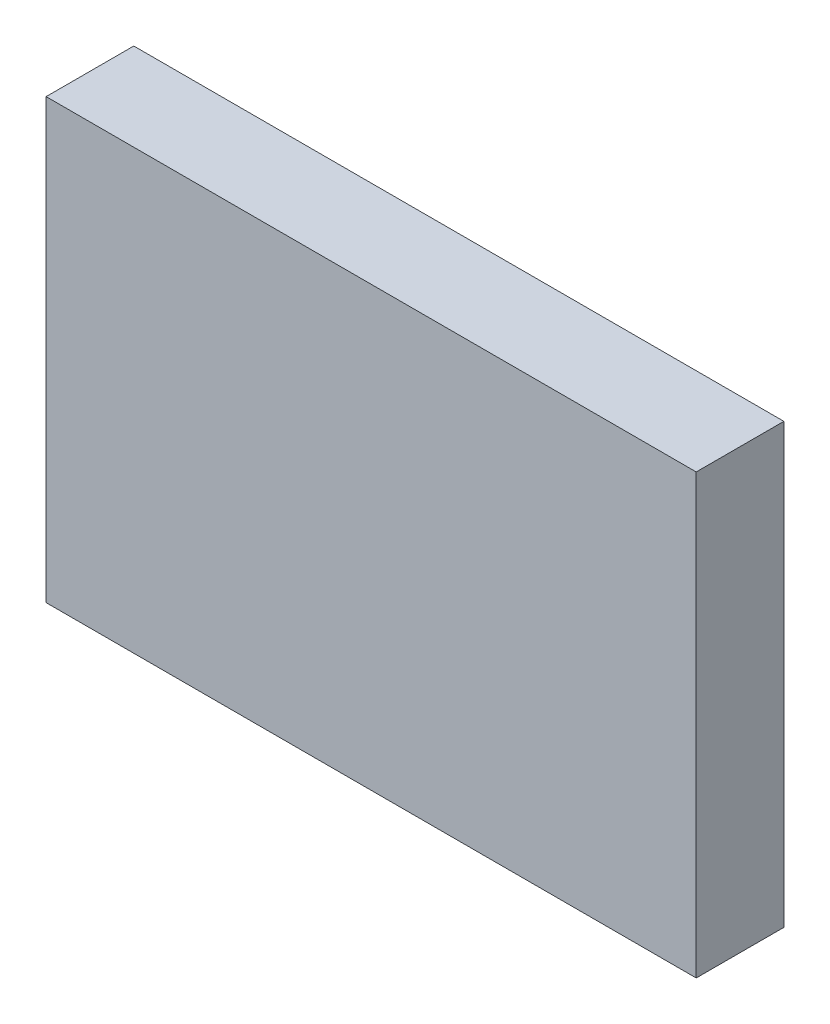
ISO-10303-21;
HEADER;
FILE_DESCRIPTION(('STEP AP214'),'2;1');
FILE_NAME('part.step','',(''),(''),'','','');
FILE_SCHEMA(('AUTOMOTIVE_DESIGN { 1 0 10303 214 1 1 1 1 }'));
ENDSEC;
DATA;
#1=APPLICATION_CONTEXT('core data for automotive mechanical design processes');
#2=APPLICATION_PROTOCOL_DEFINITION('international standard','automotive_design',2000,#1);
#3=PRODUCT_CONTEXT('',#1,'mechanical');
#4=PRODUCT('Part','Part','',(#3));
#5=PRODUCT_RELATED_PRODUCT_CATEGORY('part','',(#4));
#6=PRODUCT_DEFINITION_FORMATION('','',#4);
#7=PRODUCT_DEFINITION_CONTEXT('part definition',#1,'design');
#8=PRODUCT_DEFINITION('design','',#6,#7);
#9=PRODUCT_DEFINITION_SHAPE('','',#8);
#10=(LENGTH_UNIT() NAMED_UNIT(*) SI_UNIT(.MILLI.,.METRE.));
#11=(NAMED_UNIT(*) PLANE_ANGLE_UNIT() SI_UNIT($,.RADIAN.));
#12=(NAMED_UNIT(*) SI_UNIT($,.STERADIAN.) SOLID_ANGLE_UNIT());
#13=UNCERTAINTY_MEASURE_WITH_UNIT(LENGTH_MEASURE(1.E-05),#10,'distance_accuracy_value','');
#14=(GEOMETRIC_REPRESENTATION_CONTEXT(3) GLOBAL_UNCERTAINTY_ASSIGNED_CONTEXT((#13)) GLOBAL_UNIT_ASSIGNED_CONTEXT((#10,
#11,#12)) REPRESENTATION_CONTEXT('',''));
#15=CARTESIAN_POINT('',(0.,0.,0.));
#16=DIRECTION('',(0.,0.,1.));
#17=DIRECTION('',(1.,0.,0.));
#18=AXIS2_PLACEMENT_3D('',#15,#16,#17);
#19=CARTESIAN_POINT('',(222.5,150.,30.));
#20=DIRECTION('',(-1.,0.,0.));
#21=DIRECTION('',(0.,-1.,0.));
#22=AXIS2_PLACEMENT_3D('',#19,#20,#21);
#23=PLANE('',#22);
#24=DIRECTION('',(0.,1.,0.));
#25=VECTOR('',#24,1.);
#26=CARTESIAN_POINT('',(222.5,150.,-30.));
#27=LINE('',#26,#25);
#28=CARTESIAN_POINT('',(222.5,-150.,-30.));
#29=VERTEX_POINT('',#28);
#30=CARTESIAN_POINT('',(222.5,150.,-30.));
#31=VERTEX_POINT('',#30);
#32=EDGE_CURVE('E95',#29,#31,#27,.T.);
#33=ORIENTED_EDGE('',*,*,#32,.T.);
#34=DIRECTION('',(0.,0.,-1.));
#35=VECTOR('',#34,1.);
#36=CARTESIAN_POINT('',(222.5,150.,30.));
#37=LINE('',#36,#35);
#38=CARTESIAN_POINT('',(222.5,150.,30.));
#39=VERTEX_POINT('',#38);
#40=EDGE_CURVE('E11',#39,#31,#37,.T.);
#41=ORIENTED_EDGE('',*,*,#40,.F.);
#42=DIRECTION('',(0.,1.,0.));
#43=VECTOR('',#42,1.);
#44=CARTESIAN_POINT('',(222.5,150.,30.));
#45=LINE('',#44,#43);
#46=CARTESIAN_POINT('',(222.5,-150.,30.));
#47=VERTEX_POINT('',#46);
#48=EDGE_CURVE('E83',#47,#39,#45,.T.);
#49=ORIENTED_EDGE('',*,*,#48,.F.);
#50=DIRECTION('',(0.,0.,-1.));
#51=VECTOR('',#50,1.);
#52=CARTESIAN_POINT('',(222.5,-150.,30.));
#53=LINE('',#52,#51);
#54=EDGE_CURVE('E91',#47,#29,#53,.T.);
#55=ORIENTED_EDGE('',*,*,#54,.T.);
#56=EDGE_LOOP('',(#33,#41,#49,#55));
#57=FACE_BOUND('',#56,.T.);
#58=ADVANCED_FACE('F32',(#57),#23,.F.);
#59=CARTESIAN_POINT('',(-222.5,150.,30.));
#60=DIRECTION('',(0.,-1.,0.));
#61=DIRECTION('',(0.,0.,-1.));
#62=AXIS2_PLACEMENT_3D('',#59,#60,#61);
#63=PLANE('',#62);
#64=DIRECTION('',(-1.,0.,0.));
#65=VECTOR('',#64,1.);
#66=CARTESIAN_POINT('',(-222.5,150.,-30.));
#67=LINE('',#66,#65);
#68=CARTESIAN_POINT('',(-222.5,150.,-30.));
#69=VERTEX_POINT('',#68);
#70=EDGE_CURVE('E87',#31,#69,#67,.T.);
#71=ORIENTED_EDGE('',*,*,#70,.T.);
#72=DIRECTION('',(0.,0.,-1.));
#73=VECTOR('',#72,1.);
#74=CARTESIAN_POINT('',(-222.5,150.,30.));
#75=LINE('',#74,#73);
#76=CARTESIAN_POINT('',(-222.5,150.,30.));
#77=VERTEX_POINT('',#76);
#78=EDGE_CURVE('E40',#77,#69,#75,.T.);
#79=ORIENTED_EDGE('',*,*,#78,.F.);
#80=DIRECTION('',(-1.,0.,0.));
#81=VECTOR('',#80,1.);
#82=CARTESIAN_POINT('',(-222.5,150.,30.));
#83=LINE('',#82,#81);
#84=EDGE_CURVE('E78',#39,#77,#83,.T.);
#85=ORIENTED_EDGE('',*,*,#84,.F.);
#86=ORIENTED_EDGE('',*,*,#40,.T.);
#87=EDGE_LOOP('',(#71,#79,#85,#86));
#88=FACE_BOUND('',#87,.T.);
#89=ADVANCED_FACE('F86',(#88),#63,.F.);
#90=CARTESIAN_POINT('',(-222.5,150.,30.));
#91=DIRECTION('',(1.,0.,0.));
#92=DIRECTION('',(0.,1.,0.));
#93=AXIS2_PLACEMENT_3D('',#90,#91,#92);
#94=PLANE('',#93);
#95=DIRECTION('',(0.,-1.,0.));
#96=VECTOR('',#95,1.);
#97=CARTESIAN_POINT('',(-222.5,150.,-30.));
#98=LINE('',#97,#96);
#99=CARTESIAN_POINT('',(-222.5,-150.,-30.));
#100=VERTEX_POINT('',#99);
#101=EDGE_CURVE('E65',#69,#100,#98,.T.);
#102=ORIENTED_EDGE('',*,*,#101,.T.);
#103=DIRECTION('',(0.,0.,-1.));
#104=VECTOR('',#103,1.);
#105=CARTESIAN_POINT('',(-222.5,-150.,30.));
#106=LINE('',#105,#104);
#107=CARTESIAN_POINT('',(-222.5,-150.,30.));
#108=VERTEX_POINT('',#107);
#109=EDGE_CURVE('E88',#108,#100,#106,.T.);
#110=ORIENTED_EDGE('',*,*,#109,.F.);
#111=DIRECTION('',(0.,-1.,0.));
#112=VECTOR('',#111,1.);
#113=CARTESIAN_POINT('',(-222.5,150.,30.));
#114=LINE('',#113,#112);
#115=EDGE_CURVE('E81',#77,#108,#114,.T.);
#116=ORIENTED_EDGE('',*,*,#115,.F.);
#117=ORIENTED_EDGE('',*,*,#78,.T.);
#118=EDGE_LOOP('',(#102,#110,#116,#117));
#119=FACE_BOUND('',#118,.T.);
#120=ADVANCED_FACE('F89',(#119),#94,.F.);
#121=CARTESIAN_POINT('',(-222.5,-150.,30.));
#122=DIRECTION('',(0.,1.,0.));
#123=DIRECTION('',(0.,0.,1.));
#124=AXIS2_PLACEMENT_3D('',#121,#122,#123);
#125=PLANE('',#124);
#126=DIRECTION('',(1.,0.,0.));
#127=VECTOR('',#126,1.);
#128=CARTESIAN_POINT('',(-222.5,-150.,-30.));
#129=LINE('',#128,#127);
#130=EDGE_CURVE('E71',#100,#29,#129,.T.);
#131=ORIENTED_EDGE('',*,*,#130,.T.);
#132=ORIENTED_EDGE('',*,*,#54,.F.);
#133=DIRECTION('',(1.,0.,0.));
#134=VECTOR('',#133,1.);
#135=CARTESIAN_POINT('',(-222.5,-150.,30.));
#136=LINE('',#135,#134);
#137=EDGE_CURVE('E48',#108,#47,#136,.T.);
#138=ORIENTED_EDGE('',*,*,#137,.F.);
#139=ORIENTED_EDGE('',*,*,#109,.T.);
#140=EDGE_LOOP('',(#131,#132,#138,#139));
#141=FACE_BOUND('',#140,.T.);
#142=ADVANCED_FACE('F102',(#141),#125,.F.);
#143=CARTESIAN_POINT('',(0.,0.,30.));
#144=DIRECTION('',(0.,0.,1.));
#145=DIRECTION('',(1.,0.,0.));
#146=AXIS2_PLACEMENT_3D('',#143,#144,#145);
#147=PLANE('',#146);
#148=ORIENTED_EDGE('',*,*,#48,.T.);
#149=ORIENTED_EDGE('',*,*,#84,.T.);
#150=ORIENTED_EDGE('',*,*,#115,.T.);
#151=ORIENTED_EDGE('',*,*,#137,.T.);
#152=EDGE_LOOP('',(#148,#149,#150,#151));
#153=FACE_BOUND('',#152,.T.);
#154=ADVANCED_FACE('F79',(#153),#147,.T.);
#155=CARTESIAN_POINT('',(0.,0.,-30.));
#156=DIRECTION('',(0.,0.,1.));
#157=DIRECTION('',(1.,0.,0.));
#158=AXIS2_PLACEMENT_3D('',#155,#156,#157);
#159=PLANE('',#158);
#160=ORIENTED_EDGE('',*,*,#32,.F.);
#161=ORIENTED_EDGE('',*,*,#130,.F.);
#162=ORIENTED_EDGE('',*,*,#101,.F.);
#163=ORIENTED_EDGE('',*,*,#70,.F.);
#164=EDGE_LOOP('',(#160,#161,#162,#163));
#165=FACE_BOUND('',#164,.T.);
#166=ADVANCED_FACE('F105',(#165),#159,.F.);
#167=CLOSED_SHELL('',(#58,#89,#120,#142,#154,#166));
#168=MANIFOLD_SOLID_BREP('B2',#167);
#169=ADVANCED_BREP_SHAPE_REPRESENTATION('',(#18,#168),#14);
#170=SHAPE_DEFINITION_REPRESENTATION(#9,#169);
ENDSEC;
END-ISO-10303-21;
